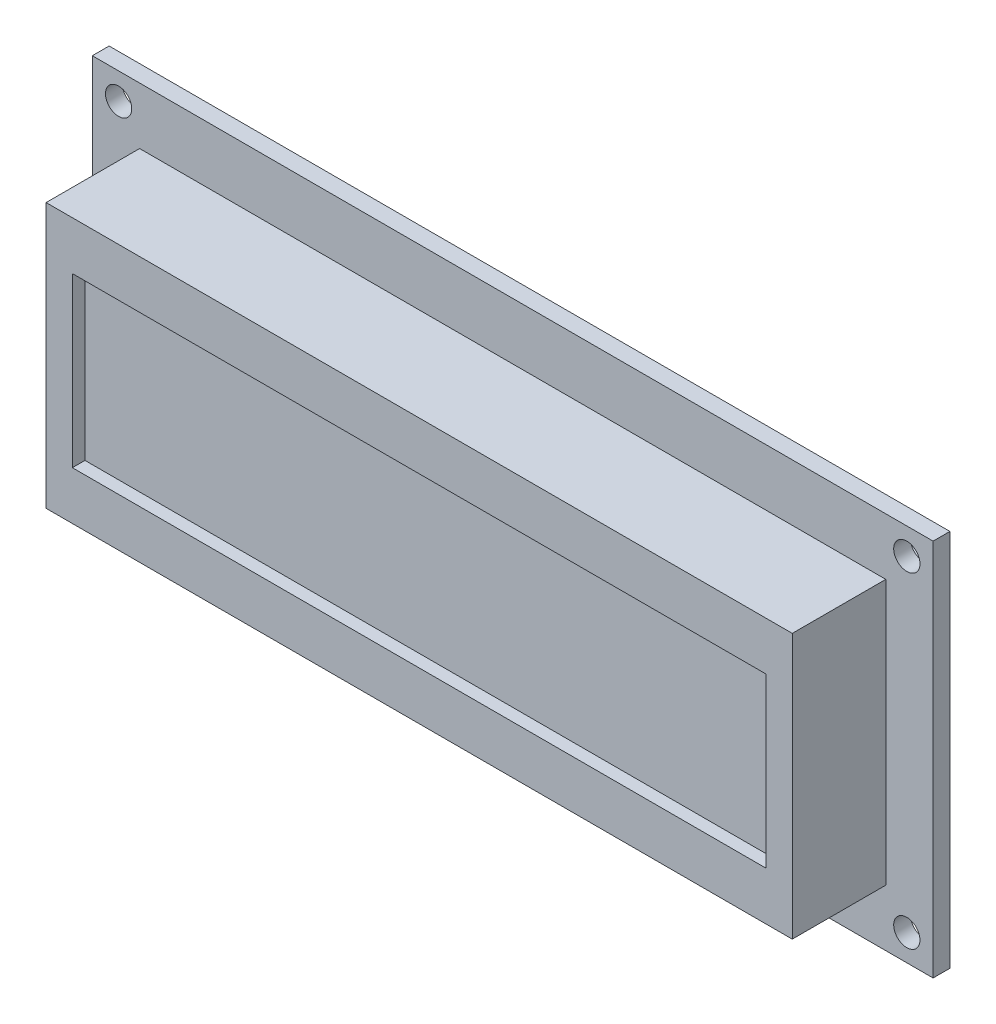
ISO-10303-21;
HEADER;
FILE_DESCRIPTION(('STEP AP214'),'2;1');
FILE_NAME('part.step','',(''),(''),'','','');
FILE_SCHEMA(('AUTOMOTIVE_DESIGN { 1 0 10303 214 1 1 1 1 }'));
ENDSEC;
DATA;
#1=APPLICATION_CONTEXT('core data for automotive mechanical design processes');
#2=APPLICATION_PROTOCOL_DEFINITION('international standard','automotive_design',2000,#1);
#3=PRODUCT_CONTEXT('',#1,'mechanical');
#4=PRODUCT('Part','Part','',(#3));
#5=PRODUCT_RELATED_PRODUCT_CATEGORY('part','',(#4));
#6=PRODUCT_DEFINITION_FORMATION('','',#4);
#7=PRODUCT_DEFINITION_CONTEXT('part definition',#1,'design');
#8=PRODUCT_DEFINITION('design','',#6,#7);
#9=PRODUCT_DEFINITION_SHAPE('','',#8);
#10=(LENGTH_UNIT() NAMED_UNIT(*) SI_UNIT(.MILLI.,.METRE.));
#11=(NAMED_UNIT(*) PLANE_ANGLE_UNIT() SI_UNIT($,.RADIAN.));
#12=(NAMED_UNIT(*) SI_UNIT($,.STERADIAN.) SOLID_ANGLE_UNIT());
#13=UNCERTAINTY_MEASURE_WITH_UNIT(LENGTH_MEASURE(1.E-05),#10,'distance_accuracy_value','');
#14=(GEOMETRIC_REPRESENTATION_CONTEXT(3) GLOBAL_UNCERTAINTY_ASSIGNED_CONTEXT((#13)) GLOBAL_UNIT_ASSIGNED_CONTEXT((#10,
#11,#12)) REPRESENTATION_CONTEXT('',''));
#15=CARTESIAN_POINT('',(0.,0.,0.));
#16=DIRECTION('',(0.,0.,1.));
#17=DIRECTION('',(1.,0.,0.));
#18=AXIS2_PLACEMENT_3D('',#15,#16,#17);
#19=CARTESIAN_POINT('',(0.,0.,8.9));
#20=DIRECTION('',(0.,0.,1.));
#21=DIRECTION('',(1.,0.,0.));
#22=AXIS2_PLACEMENT_3D('',#19,#20,#21);
#23=PLANE('',#22);
#24=DIRECTION('',(0.,-1.,0.));
#25=VECTOR('',#24,1.);
#26=CARTESIAN_POINT('',(35.5,0.,8.9));
#27=LINE('',#26,#25);
#28=CARTESIAN_POINT('',(35.5,12.6,8.9));
#29=VERTEX_POINT('',#28);
#30=CARTESIAN_POINT('',(35.5,-12.6,8.9));
#31=VERTEX_POINT('',#30);
#32=EDGE_CURVE('E174',#29,#31,#27,.T.);
#33=ORIENTED_EDGE('',*,*,#32,.F.);
#34=DIRECTION('',(1.,0.,0.));
#35=VECTOR('',#34,1.);
#36=CARTESIAN_POINT('',(0.,12.6,8.9));
#37=LINE('',#36,#35);
#38=CARTESIAN_POINT('',(-35.5,12.6,8.9));
#39=VERTEX_POINT('',#38);
#40=EDGE_CURVE('E227',#39,#29,#37,.T.);
#41=ORIENTED_EDGE('',*,*,#40,.F.);
#42=DIRECTION('',(0.,-1.,0.));
#43=VECTOR('',#42,1.);
#44=CARTESIAN_POINT('',(-35.5,0.,8.9));
#45=LINE('',#44,#43);
#46=CARTESIAN_POINT('',(-35.5,-12.6,8.9));
#47=VERTEX_POINT('',#46);
#48=EDGE_CURVE('E231',#39,#47,#45,.T.);
#49=ORIENTED_EDGE('',*,*,#48,.T.);
#50=DIRECTION('',(1.,0.,0.));
#51=VECTOR('',#50,1.);
#52=CARTESIAN_POINT('',(0.,-12.6,8.9));
#53=LINE('',#52,#51);
#54=EDGE_CURVE('E212',#47,#31,#53,.T.);
#55=ORIENTED_EDGE('',*,*,#54,.T.);
#56=EDGE_LOOP('',(#33,#41,#49,#55));
#57=FACE_BOUND('',#56,.T.);
#58=DIRECTION('',(-1.,0.,0.));
#59=VECTOR('',#58,1.);
#60=CARTESIAN_POINT('',(0.,-8.,8.9));
#61=LINE('',#60,#59);
#62=CARTESIAN_POINT('',(33.,-8.,8.9));
#63=VERTEX_POINT('',#62);
#64=CARTESIAN_POINT('',(-33.,-8.,8.9));
#65=VERTEX_POINT('',#64);
#66=EDGE_CURVE('E165',#63,#65,#61,.T.);
#67=ORIENTED_EDGE('',*,*,#66,.T.);
#68=DIRECTION('',(0.,1.,0.));
#69=VECTOR('',#68,1.);
#70=CARTESIAN_POINT('',(-33.,0.,8.9));
#71=LINE('',#70,#69);
#72=CARTESIAN_POINT('',(-33.,8.,8.9));
#73=VERTEX_POINT('',#72);
#74=EDGE_CURVE('E57',#65,#73,#71,.T.);
#75=ORIENTED_EDGE('',*,*,#74,.T.);
#76=DIRECTION('',(-1.,0.,0.));
#77=VECTOR('',#76,1.);
#78=CARTESIAN_POINT('',(0.,8.,8.9));
#79=LINE('',#78,#77);
#80=CARTESIAN_POINT('',(33.,8.,8.9));
#81=VERTEX_POINT('',#80);
#82=EDGE_CURVE('E172',#81,#73,#79,.T.);
#83=ORIENTED_EDGE('',*,*,#82,.F.);
#84=DIRECTION('',(0.,1.,0.));
#85=VECTOR('',#84,1.);
#86=CARTESIAN_POINT('',(33.,0.,8.9));
#87=LINE('',#86,#85);
#88=EDGE_CURVE('E194',#63,#81,#87,.T.);
#89=ORIENTED_EDGE('',*,*,#88,.F.);
#90=EDGE_LOOP('',(#67,#75,#83,#89));
#91=FACE_BOUND('',#90,.T.);
#92=ADVANCED_FACE('F41',(#57,#91),#23,.T.);
#93=CARTESIAN_POINT('',(0.,0.,-1.6));
#94=DIRECTION('',(0.,0.,1.));
#95=DIRECTION('',(1.,0.,0.));
#96=AXIS2_PLACEMENT_3D('',#93,#94,#95);
#97=PLANE('',#96);
#98=CARTESIAN_POINT('',(-37.5,15.5,-1.6));
#99=DIRECTION('',(0.,0.,1.));
#100=DIRECTION('',(1.,0.,0.));
#101=AXIS2_PLACEMENT_3D('',#98,#99,#100);
#102=CIRCLE('',#101,1.25);
#103=CARTESIAN_POINT('',(-36.25,15.5,-1.6));
#104=VERTEX_POINT('',#103);
#105=EDGE_CURVE('E191',#104,#104,#102,.T.);
#106=ORIENTED_EDGE('',*,*,#105,.T.);
#107=EDGE_LOOP('',(#106));
#108=FACE_BOUND('',#107,.T.);
#109=CARTESIAN_POINT('',(37.5,-15.5,-1.6));
#110=DIRECTION('',(0.,0.,1.));
#111=DIRECTION('',(1.,0.,0.));
#112=AXIS2_PLACEMENT_3D('',#109,#110,#111);
#113=CIRCLE('',#112,1.25);
#114=CARTESIAN_POINT('',(38.75,-15.5,-1.6));
#115=VERTEX_POINT('',#114);
#116=EDGE_CURVE('E567',#115,#115,#113,.T.);
#117=ORIENTED_EDGE('',*,*,#116,.T.);
#118=EDGE_LOOP('',(#117));
#119=FACE_BOUND('',#118,.T.);
#120=CARTESIAN_POINT('',(-37.5,-15.5,-1.6));
#121=DIRECTION('',(0.,0.,1.));
#122=DIRECTION('',(1.,0.,0.));
#123=AXIS2_PLACEMENT_3D('',#120,#121,#122);
#124=CIRCLE('',#123,1.25);
#125=CARTESIAN_POINT('',(-36.25,-15.5,-1.6));
#126=VERTEX_POINT('',#125);
#127=EDGE_CURVE('E570',#126,#126,#124,.T.);
#128=ORIENTED_EDGE('',*,*,#127,.T.);
#129=EDGE_LOOP('',(#128));
#130=FACE_BOUND('',#129,.T.);
#131=CARTESIAN_POINT('',(37.5,15.5,-1.6));
#132=DIRECTION('',(0.,0.,1.));
#133=DIRECTION('',(1.,0.,0.));
#134=AXIS2_PLACEMENT_3D('',#131,#132,#133);
#135=CIRCLE('',#134,1.25);
#136=CARTESIAN_POINT('',(38.75,15.5,-1.6));
#137=VERTEX_POINT('',#136);
#138=EDGE_CURVE('E576',#137,#137,#135,.T.);
#139=ORIENTED_EDGE('',*,*,#138,.T.);
#140=EDGE_LOOP('',(#139));
#141=FACE_BOUND('',#140,.T.);
#142=DIRECTION('',(0.,-1.,0.));
#143=VECTOR('',#142,1.);
#144=CARTESIAN_POINT('',(40.,0.,-1.6));
#145=LINE('',#144,#143);
#146=CARTESIAN_POINT('',(40.,18.,-1.6));
#147=VERTEX_POINT('',#146);
#148=CARTESIAN_POINT('',(40.,-18.,-1.6));
#149=VERTEX_POINT('',#148);
#150=EDGE_CURVE('E270',#147,#149,#145,.T.);
#151=ORIENTED_EDGE('',*,*,#150,.T.);
#152=DIRECTION('',(1.,0.,0.));
#153=VECTOR('',#152,1.);
#154=CARTESIAN_POINT('',(0.,-18.,-1.6));
#155=LINE('',#154,#153);
#156=CARTESIAN_POINT('',(-40.,-18.,-1.6));
#157=VERTEX_POINT('',#156);
#158=EDGE_CURVE('E281',#157,#149,#155,.T.);
#159=ORIENTED_EDGE('',*,*,#158,.F.);
#160=DIRECTION('',(0.,-1.,0.));
#161=VECTOR('',#160,1.);
#162=CARTESIAN_POINT('',(-40.,0.,-1.6));
#163=LINE('',#162,#161);
#164=CARTESIAN_POINT('',(-40.,18.,-1.6));
#165=VERTEX_POINT('',#164);
#166=EDGE_CURVE('E277',#165,#157,#163,.T.);
#167=ORIENTED_EDGE('',*,*,#166,.F.);
#168=DIRECTION('',(1.,0.,0.));
#169=VECTOR('',#168,1.);
#170=CARTESIAN_POINT('',(0.,18.,-1.6));
#171=LINE('',#170,#169);
#172=EDGE_CURVE('E273',#165,#147,#171,.T.);
#173=ORIENTED_EDGE('',*,*,#172,.T.);
#174=EDGE_LOOP('',(#151,#159,#167,#173));
#175=FACE_BOUND('',#174,.T.);
#176=DIRECTION('',(0.,-1.,0.));
#177=VECTOR('',#176,1.);
#178=CARTESIAN_POINT('',(35.5,0.,-1.6));
#179=LINE('',#178,#177);
#180=CARTESIAN_POINT('',(35.5,12.6,-1.6));
#181=VERTEX_POINT('',#180);
#182=CARTESIAN_POINT('',(35.5,-12.6,-1.6));
#183=VERTEX_POINT('',#182);
#184=EDGE_CURVE('E266',#181,#183,#179,.T.);
#185=ORIENTED_EDGE('',*,*,#184,.F.);
#186=DIRECTION('',(1.,0.,0.));
#187=VECTOR('',#186,1.);
#188=CARTESIAN_POINT('',(0.,12.6,-1.6));
#189=LINE('',#188,#187);
#190=CARTESIAN_POINT('',(-35.5,12.6,-1.6));
#191=VERTEX_POINT('',#190);
#192=EDGE_CURVE('E242',#191,#181,#189,.T.);
#193=ORIENTED_EDGE('',*,*,#192,.F.);
#194=DIRECTION('',(0.,-1.,0.));
#195=VECTOR('',#194,1.);
#196=CARTESIAN_POINT('',(-35.5,0.,-1.6));
#197=LINE('',#196,#195);
#198=CARTESIAN_POINT('',(-35.5,-12.6,-1.6));
#199=VERTEX_POINT('',#198);
#200=EDGE_CURVE('E261',#191,#199,#197,.T.);
#201=ORIENTED_EDGE('',*,*,#200,.T.);
#202=DIRECTION('',(1.,0.,0.));
#203=VECTOR('',#202,1.);
#204=CARTESIAN_POINT('',(0.,-12.6,-1.6));
#205=LINE('',#204,#203);
#206=EDGE_CURVE('E65',#199,#183,#205,.T.);
#207=ORIENTED_EDGE('',*,*,#206,.T.);
#208=EDGE_LOOP('',(#185,#193,#201,#207));
#209=FACE_BOUND('',#208,.T.);
#210=ADVANCED_FACE('F345',(#108,#119,#130,#141,#175,#209),#97,.F.);
#211=CARTESIAN_POINT('',(0.,0.,0.));
#212=DIRECTION('',(0.,0.,1.));
#213=DIRECTION('',(1.,0.,0.));
#214=AXIS2_PLACEMENT_3D('',#211,#212,#213);
#215=PLANE('',#214);
#216=CARTESIAN_POINT('',(-37.5,15.5,0.));
#217=DIRECTION('',(0.,0.,1.));
#218=DIRECTION('',(-1.,0.,0.));
#219=AXIS2_PLACEMENT_3D('',#216,#217,#218);
#220=CIRCLE('',#219,1.25);
#221=CARTESIAN_POINT('',(-38.75,15.5,0.));
#222=VERTEX_POINT('',#221);
#223=EDGE_CURVE('E563',#222,#222,#220,.T.);
#224=ORIENTED_EDGE('',*,*,#223,.F.);
#225=EDGE_LOOP('',(#224));
#226=FACE_BOUND('',#225,.T.);
#227=CARTESIAN_POINT('',(37.5,-15.5,0.));
#228=DIRECTION('',(0.,0.,1.));
#229=DIRECTION('',(-1.,0.,0.));
#230=AXIS2_PLACEMENT_3D('',#227,#228,#229);
#231=CIRCLE('',#230,1.25);
#232=CARTESIAN_POINT('',(36.25,-15.5,0.));
#233=VERTEX_POINT('',#232);
#234=EDGE_CURVE('E584',#233,#233,#231,.T.);
#235=ORIENTED_EDGE('',*,*,#234,.F.);
#236=EDGE_LOOP('',(#235));
#237=FACE_BOUND('',#236,.T.);
#238=CARTESIAN_POINT('',(-37.5,-15.5,0.));
#239=DIRECTION('',(0.,0.,1.));
#240=DIRECTION('',(1.,0.,0.));
#241=AXIS2_PLACEMENT_3D('',#238,#239,#240);
#242=CIRCLE('',#241,1.25);
#243=CARTESIAN_POINT('',(-36.25,-15.5,0.));
#244=VERTEX_POINT('',#243);
#245=EDGE_CURVE('E588',#244,#244,#242,.T.);
#246=ORIENTED_EDGE('',*,*,#245,.F.);
#247=EDGE_LOOP('',(#246));
#248=FACE_BOUND('',#247,.T.);
#249=CARTESIAN_POINT('',(37.5,15.5,0.));
#250=DIRECTION('',(0.,0.,1.));
#251=DIRECTION('',(1.,0.,0.));
#252=AXIS2_PLACEMENT_3D('',#249,#250,#251);
#253=CIRCLE('',#252,1.25);
#254=CARTESIAN_POINT('',(38.75,15.5,0.));
#255=VERTEX_POINT('',#254);
#256=EDGE_CURVE('E580',#255,#255,#253,.T.);
#257=ORIENTED_EDGE('',*,*,#256,.F.);
#258=EDGE_LOOP('',(#257));
#259=FACE_BOUND('',#258,.T.);
#260=DIRECTION('',(0.,-1.,0.));
#261=VECTOR('',#260,1.);
#262=CARTESIAN_POINT('',(40.,0.,0.));
#263=LINE('',#262,#261);
#264=CARTESIAN_POINT('',(40.,18.,0.));
#265=VERTEX_POINT('',#264);
#266=CARTESIAN_POINT('',(40.,-18.,0.));
#267=VERTEX_POINT('',#266);
#268=EDGE_CURVE('E269',#265,#267,#263,.T.);
#269=ORIENTED_EDGE('',*,*,#268,.F.);
#270=DIRECTION('',(1.,0.,0.));
#271=VECTOR('',#270,1.);
#272=CARTESIAN_POINT('',(0.,18.,0.));
#273=LINE('',#272,#271);
#274=CARTESIAN_POINT('',(-40.,18.,0.));
#275=VERTEX_POINT('',#274);
#276=EDGE_CURVE('E289',#275,#265,#273,.T.);
#277=ORIENTED_EDGE('',*,*,#276,.F.);
#278=DIRECTION('',(0.,-1.,0.));
#279=VECTOR('',#278,1.);
#280=CARTESIAN_POINT('',(-40.,0.,0.));
#281=LINE('',#280,#279);
#282=CARTESIAN_POINT('',(-40.,-18.,0.));
#283=VERTEX_POINT('',#282);
#284=EDGE_CURVE('E292',#275,#283,#281,.T.);
#285=ORIENTED_EDGE('',*,*,#284,.T.);
#286=DIRECTION('',(1.,0.,0.));
#287=VECTOR('',#286,1.);
#288=CARTESIAN_POINT('',(0.,-18.,0.));
#289=LINE('',#288,#287);
#290=EDGE_CURVE('E274',#283,#267,#289,.T.);
#291=ORIENTED_EDGE('',*,*,#290,.T.);
#292=EDGE_LOOP('',(#269,#277,#285,#291));
#293=FACE_BOUND('',#292,.T.);
#294=DIRECTION('',(1.,0.,0.));
#295=VECTOR('',#294,1.);
#296=CARTESIAN_POINT('',(0.,12.6,0.));
#297=LINE('',#296,#295);
#298=CARTESIAN_POINT('',(-35.5,12.6,0.));
#299=VERTEX_POINT('',#298);
#300=CARTESIAN_POINT('',(35.5,12.6,0.));
#301=VERTEX_POINT('',#300);
#302=EDGE_CURVE('E302',#299,#301,#297,.T.);
#303=ORIENTED_EDGE('',*,*,#302,.T.);
#304=DIRECTION('',(0.,-1.,0.));
#305=VECTOR('',#304,1.);
#306=CARTESIAN_POINT('',(35.5,0.,0.));
#307=LINE('',#306,#305);
#308=CARTESIAN_POINT('',(35.5,-12.6,0.));
#309=VERTEX_POINT('',#308);
#310=EDGE_CURVE('E11',#301,#309,#307,.T.);
#311=ORIENTED_EDGE('',*,*,#310,.T.);
#312=DIRECTION('',(1.,0.,0.));
#313=VECTOR('',#312,1.);
#314=CARTESIAN_POINT('',(0.,-12.6,0.));
#315=LINE('',#314,#313);
#316=CARTESIAN_POINT('',(-35.5,-12.6,0.));
#317=VERTEX_POINT('',#316);
#318=EDGE_CURVE('E50',#317,#309,#315,.T.);
#319=ORIENTED_EDGE('',*,*,#318,.F.);
#320=DIRECTION('',(0.,-1.,0.));
#321=VECTOR('',#320,1.);
#322=CARTESIAN_POINT('',(-35.5,0.,0.));
#323=LINE('',#322,#321);
#324=EDGE_CURVE('E315',#299,#317,#323,.T.);
#325=ORIENTED_EDGE('',*,*,#324,.F.);
#326=EDGE_LOOP('',(#303,#311,#319,#325));
#327=FACE_BOUND('',#326,.T.);
#328=ADVANCED_FACE('F331',(#226,#237,#248,#259,#293,#327),#215,.T.);
#329=CARTESIAN_POINT('',(40.,0.,-1.6));
#330=DIRECTION('',(-1.,0.,0.));
#331=DIRECTION('',(0.,0.,1.));
#332=AXIS2_PLACEMENT_3D('',#329,#330,#331);
#333=PLANE('',#332);
#334=ORIENTED_EDGE('',*,*,#268,.T.);
#335=DIRECTION('',(0.,0.,1.));
#336=VECTOR('',#335,1.);
#337=CARTESIAN_POINT('',(40.,-18.,-1.6));
#338=LINE('',#337,#336);
#339=EDGE_CURVE('E299',#149,#267,#338,.T.);
#340=ORIENTED_EDGE('',*,*,#339,.F.);
#341=ORIENTED_EDGE('',*,*,#150,.F.);
#342=DIRECTION('',(0.,0.,1.));
#343=VECTOR('',#342,1.);
#344=CARTESIAN_POINT('',(40.,18.,-1.6));
#345=LINE('',#344,#343);
#346=EDGE_CURVE('E285',#147,#265,#345,.T.);
#347=ORIENTED_EDGE('',*,*,#346,.T.);
#348=EDGE_LOOP('',(#334,#340,#341,#347));
#349=FACE_BOUND('',#348,.T.);
#350=ADVANCED_FACE('F43',(#349),#333,.F.);
#351=CARTESIAN_POINT('',(0.,-18.,-1.6));
#352=DIRECTION('',(0.,-1.,0.));
#353=DIRECTION('',(1.,0.,0.));
#354=AXIS2_PLACEMENT_3D('',#351,#352,#353);
#355=PLANE('',#354);
#356=ORIENTED_EDGE('',*,*,#290,.F.);
#357=DIRECTION('',(0.,0.,1.));
#358=VECTOR('',#357,1.);
#359=CARTESIAN_POINT('',(-40.,-18.,-1.6));
#360=LINE('',#359,#358);
#361=EDGE_CURVE('E303',#157,#283,#360,.T.);
#362=ORIENTED_EDGE('',*,*,#361,.F.);
#363=ORIENTED_EDGE('',*,*,#158,.T.);
#364=ORIENTED_EDGE('',*,*,#339,.T.);
#365=EDGE_LOOP('',(#356,#362,#363,#364));
#366=FACE_BOUND('',#365,.T.);
#367=ADVANCED_FACE('F388',(#366),#355,.T.);
#368=CARTESIAN_POINT('',(-40.,0.,-1.6));
#369=DIRECTION('',(-1.,0.,0.));
#370=DIRECTION('',(0.,-1.,0.));
#371=AXIS2_PLACEMENT_3D('',#368,#369,#370);
#372=PLANE('',#371);
#373=ORIENTED_EDGE('',*,*,#284,.F.);
#374=DIRECTION('',(0.,0.,1.));
#375=VECTOR('',#374,1.);
#376=CARTESIAN_POINT('',(-40.,18.,-1.6));
#377=LINE('',#376,#375);
#378=EDGE_CURVE('E306',#165,#275,#377,.T.);
#379=ORIENTED_EDGE('',*,*,#378,.F.);
#380=ORIENTED_EDGE('',*,*,#166,.T.);
#381=ORIENTED_EDGE('',*,*,#361,.T.);
#382=EDGE_LOOP('',(#373,#379,#380,#381));
#383=FACE_BOUND('',#382,.T.);
#384=ADVANCED_FACE('F391',(#383),#372,.T.);
#385=CARTESIAN_POINT('',(0.,18.,-1.6));
#386=DIRECTION('',(0.,-1.,0.));
#387=DIRECTION('',(1.,0.,0.));
#388=AXIS2_PLACEMENT_3D('',#385,#386,#387);
#389=PLANE('',#388);
#390=ORIENTED_EDGE('',*,*,#276,.T.);
#391=ORIENTED_EDGE('',*,*,#346,.F.);
#392=ORIENTED_EDGE('',*,*,#172,.F.);
#393=ORIENTED_EDGE('',*,*,#378,.T.);
#394=EDGE_LOOP('',(#390,#391,#392,#393));
#395=FACE_BOUND('',#394,.T.);
#396=ADVANCED_FACE('F378',(#395),#389,.F.);
#397=CARTESIAN_POINT('',(0.,12.6,-4.6));
#398=DIRECTION('',(0.,-1.,0.));
#399=DIRECTION('',(1.,0.,0.));
#400=AXIS2_PLACEMENT_3D('',#397,#398,#399);
#401=PLANE('',#400);
#402=ORIENTED_EDGE('',*,*,#302,.F.);
#403=DIRECTION('',(0.,0.,1.));
#404=VECTOR('',#403,1.);
#405=CARTESIAN_POINT('',(-35.5,12.6,-4.6));
#406=LINE('',#405,#404);
#407=EDGE_CURVE('E253',#299,#39,#406,.T.);
#408=ORIENTED_EDGE('',*,*,#407,.T.);
#409=ORIENTED_EDGE('',*,*,#40,.T.);
#410=DIRECTION('',(0.,0.,1.));
#411=VECTOR('',#410,1.);
#412=CARTESIAN_POINT('',(35.5,12.6,-4.6));
#413=LINE('',#412,#411);
#414=EDGE_CURVE('E223',#301,#29,#413,.T.);
#415=ORIENTED_EDGE('',*,*,#414,.F.);
#416=EDGE_LOOP('',(#402,#408,#409,#415));
#417=FACE_BOUND('',#416,.T.);
#418=ADVANCED_FACE('F334',(#417),#401,.F.);
#419=CARTESIAN_POINT('',(-35.5,0.,-4.6));
#420=DIRECTION('',(-1.,0.,0.));
#421=DIRECTION('',(0.,-1.,0.));
#422=AXIS2_PLACEMENT_3D('',#419,#420,#421);
#423=PLANE('',#422);
#424=ORIENTED_EDGE('',*,*,#407,.F.);
#425=ORIENTED_EDGE('',*,*,#324,.T.);
#426=DIRECTION('',(0.,0.,1.));
#427=VECTOR('',#426,1.);
#428=CARTESIAN_POINT('',(-35.5,-12.6,-4.6));
#429=LINE('',#428,#427);
#430=EDGE_CURVE('E248',#317,#47,#429,.T.);
#431=ORIENTED_EDGE('',*,*,#430,.T.);
#432=ORIENTED_EDGE('',*,*,#48,.F.);
#433=EDGE_LOOP('',(#424,#425,#431,#432));
#434=FACE_BOUND('',#433,.T.);
#435=ADVANCED_FACE('F338',(#434),#423,.T.);
#436=CARTESIAN_POINT('',(0.,-12.6,-4.6));
#437=DIRECTION('',(0.,-1.,0.));
#438=DIRECTION('',(1.,0.,0.));
#439=AXIS2_PLACEMENT_3D('',#436,#437,#438);
#440=PLANE('',#439);
#441=ORIENTED_EDGE('',*,*,#430,.F.);
#442=ORIENTED_EDGE('',*,*,#318,.T.);
#443=DIRECTION('',(0.,0.,1.));
#444=VECTOR('',#443,1.);
#445=CARTESIAN_POINT('',(35.5,-12.6,-4.6));
#446=LINE('',#445,#444);
#447=EDGE_CURVE('E243',#309,#31,#446,.T.);
#448=ORIENTED_EDGE('',*,*,#447,.T.);
#449=ORIENTED_EDGE('',*,*,#54,.F.);
#450=EDGE_LOOP('',(#441,#442,#448,#449));
#451=FACE_BOUND('',#450,.T.);
#452=ADVANCED_FACE('F322',(#451),#440,.T.);
#453=CARTESIAN_POINT('',(35.5,0.,-4.6));
#454=DIRECTION('',(-1.,0.,0.));
#455=DIRECTION('',(0.,0.,1.));
#456=AXIS2_PLACEMENT_3D('',#453,#454,#455);
#457=PLANE('',#456);
#458=ORIENTED_EDGE('',*,*,#310,.F.);
#459=ORIENTED_EDGE('',*,*,#414,.T.);
#460=ORIENTED_EDGE('',*,*,#32,.T.);
#461=ORIENTED_EDGE('',*,*,#447,.F.);
#462=EDGE_LOOP('',(#458,#459,#460,#461));
#463=FACE_BOUND('',#462,.T.);
#464=ADVANCED_FACE('F328',(#463),#457,.F.);
#465=CARTESIAN_POINT('',(35.5,12.6,-4.6));
#466=VERTEX_POINT('',#465);
#467=EDGE_CURVE('E254',#466,#181,#413,.T.);
#468=ORIENTED_EDGE('',*,*,#467,.T.);
#469=ORIENTED_EDGE('',*,*,#184,.T.);
#470=CARTESIAN_POINT('',(35.5,-12.6,-4.6));
#471=VERTEX_POINT('',#470);
#472=EDGE_CURVE('E238',#471,#183,#446,.T.);
#473=ORIENTED_EDGE('',*,*,#472,.F.);
#474=DIRECTION('',(0.,-1.,0.));
#475=VECTOR('',#474,1.);
#476=CARTESIAN_POINT('',(35.5,0.,-4.6));
#477=LINE('',#476,#475);
#478=EDGE_CURVE('E208',#466,#471,#477,.T.);
#479=ORIENTED_EDGE('',*,*,#478,.F.);
#480=EDGE_LOOP('',(#468,#469,#473,#479));
#481=FACE_BOUND('',#480,.T.);
#482=ADVANCED_FACE('F381',(#481),#457,.F.);
#483=ORIENTED_EDGE('',*,*,#206,.F.);
#484=CARTESIAN_POINT('',(-35.5,-12.6,-4.6));
#485=VERTEX_POINT('',#484);
#486=EDGE_CURVE('E244',#485,#199,#429,.T.);
#487=ORIENTED_EDGE('',*,*,#486,.F.);
#488=DIRECTION('',(1.,0.,0.));
#489=VECTOR('',#488,1.);
#490=CARTESIAN_POINT('',(0.,-12.6,-4.6));
#491=LINE('',#490,#489);
#492=EDGE_CURVE('E219',#485,#471,#491,.T.);
#493=ORIENTED_EDGE('',*,*,#492,.T.);
#494=ORIENTED_EDGE('',*,*,#472,.T.);
#495=EDGE_LOOP('',(#483,#487,#493,#494));
#496=FACE_BOUND('',#495,.T.);
#497=ADVANCED_FACE('F372',(#496),#440,.T.);
#498=ORIENTED_EDGE('',*,*,#200,.F.);
#499=CARTESIAN_POINT('',(-35.5,12.6,-4.6));
#500=VERTEX_POINT('',#499);
#501=EDGE_CURVE('E249',#500,#191,#406,.T.);
#502=ORIENTED_EDGE('',*,*,#501,.F.);
#503=DIRECTION('',(0.,-1.,0.));
#504=VECTOR('',#503,1.);
#505=CARTESIAN_POINT('',(-35.5,0.,-4.6));
#506=LINE('',#505,#504);
#507=EDGE_CURVE('E215',#500,#485,#506,.T.);
#508=ORIENTED_EDGE('',*,*,#507,.T.);
#509=ORIENTED_EDGE('',*,*,#486,.T.);
#510=EDGE_LOOP('',(#498,#502,#508,#509));
#511=FACE_BOUND('',#510,.T.);
#512=ADVANCED_FACE('F375',(#511),#423,.T.);
#513=ORIENTED_EDGE('',*,*,#501,.T.);
#514=ORIENTED_EDGE('',*,*,#192,.T.);
#515=ORIENTED_EDGE('',*,*,#467,.F.);
#516=DIRECTION('',(1.,0.,0.));
#517=VECTOR('',#516,1.);
#518=CARTESIAN_POINT('',(0.,12.6,-4.6));
#519=LINE('',#518,#517);
#520=EDGE_CURVE('E211',#500,#466,#519,.T.);
#521=ORIENTED_EDGE('',*,*,#520,.F.);
#522=EDGE_LOOP('',(#513,#514,#515,#521));
#523=FACE_BOUND('',#522,.T.);
#524=ADVANCED_FACE('F367',(#523),#401,.F.);
#525=CARTESIAN_POINT('',(0.,0.,-4.6));
#526=DIRECTION('',(0.,0.,1.));
#527=DIRECTION('',(1.,0.,0.));
#528=AXIS2_PLACEMENT_3D('',#525,#526,#527);
#529=PLANE('',#528);
#530=ORIENTED_EDGE('',*,*,#478,.T.);
#531=ORIENTED_EDGE('',*,*,#492,.F.);
#532=ORIENTED_EDGE('',*,*,#507,.F.);
#533=ORIENTED_EDGE('',*,*,#520,.T.);
#534=EDGE_LOOP('',(#530,#531,#532,#533));
#535=FACE_BOUND('',#534,.T.);
#536=ADVANCED_FACE('F365',(#535),#529,.F.);
#537=CARTESIAN_POINT('',(-33.,0.,7.7));
#538=DIRECTION('',(1.,0.,0.));
#539=DIRECTION('',(0.,0.,-1.));
#540=AXIS2_PLACEMENT_3D('',#537,#538,#539);
#541=PLANE('',#540);
#542=ORIENTED_EDGE('',*,*,#74,.F.);
#543=DIRECTION('',(0.,0.,1.));
#544=VECTOR('',#543,1.);
#545=CARTESIAN_POINT('',(-33.,-8.,7.7));
#546=LINE('',#545,#544);
#547=CARTESIAN_POINT('',(-33.,-8.,7.7));
#548=VERTEX_POINT('',#547);
#549=EDGE_CURVE('E159',#548,#65,#546,.T.);
#550=ORIENTED_EDGE('',*,*,#549,.F.);
#551=DIRECTION('',(0.,1.,0.));
#552=VECTOR('',#551,1.);
#553=CARTESIAN_POINT('',(-33.,0.,7.7));
#554=LINE('',#553,#552);
#555=CARTESIAN_POINT('',(-33.,8.,7.7));
#556=VERTEX_POINT('',#555);
#557=EDGE_CURVE('E154',#548,#556,#554,.T.);
#558=ORIENTED_EDGE('',*,*,#557,.T.);
#559=DIRECTION('',(0.,0.,1.));
#560=VECTOR('',#559,1.);
#561=CARTESIAN_POINT('',(-33.,8.,7.7));
#562=LINE('',#561,#560);
#563=EDGE_CURVE('E157',#556,#73,#562,.T.);
#564=ORIENTED_EDGE('',*,*,#563,.T.);
#565=EDGE_LOOP('',(#542,#550,#558,#564));
#566=FACE_BOUND('',#565,.T.);
#567=ADVANCED_FACE('F156',(#566),#541,.T.);
#568=CARTESIAN_POINT('',(0.,8.,7.7));
#569=DIRECTION('',(0.,1.,0.));
#570=DIRECTION('',(0.,0.,1.));
#571=AXIS2_PLACEMENT_3D('',#568,#569,#570);
#572=PLANE('',#571);
#573=ORIENTED_EDGE('',*,*,#82,.T.);
#574=ORIENTED_EDGE('',*,*,#563,.F.);
#575=DIRECTION('',(-1.,0.,0.));
#576=VECTOR('',#575,1.);
#577=CARTESIAN_POINT('',(0.,8.,7.7));
#578=LINE('',#577,#576);
#579=CARTESIAN_POINT('',(33.,8.,7.7));
#580=VERTEX_POINT('',#579);
#581=EDGE_CURVE('E164',#580,#556,#578,.T.);
#582=ORIENTED_EDGE('',*,*,#581,.F.);
#583=DIRECTION('',(0.,0.,1.));
#584=VECTOR('',#583,1.);
#585=CARTESIAN_POINT('',(33.,8.,7.7));
#586=LINE('',#585,#584);
#587=EDGE_CURVE('E175',#580,#81,#586,.T.);
#588=ORIENTED_EDGE('',*,*,#587,.T.);
#589=EDGE_LOOP('',(#573,#574,#582,#588));
#590=FACE_BOUND('',#589,.T.);
#591=ADVANCED_FACE('F169',(#590),#572,.F.);
#592=CARTESIAN_POINT('',(33.,0.,7.7));
#593=DIRECTION('',(1.,0.,0.));
#594=DIRECTION('',(0.,0.,-1.));
#595=AXIS2_PLACEMENT_3D('',#592,#593,#594);
#596=PLANE('',#595);
#597=ORIENTED_EDGE('',*,*,#88,.T.);
#598=ORIENTED_EDGE('',*,*,#587,.F.);
#599=DIRECTION('',(0.,1.,0.));
#600=VECTOR('',#599,1.);
#601=CARTESIAN_POINT('',(33.,0.,7.7));
#602=LINE('',#601,#600);
#603=CARTESIAN_POINT('',(33.,-8.,7.7));
#604=VERTEX_POINT('',#603);
#605=EDGE_CURVE('E179',#604,#580,#602,.T.);
#606=ORIENTED_EDGE('',*,*,#605,.F.);
#607=DIRECTION('',(0.,0.,1.));
#608=VECTOR('',#607,1.);
#609=CARTESIAN_POINT('',(33.,-8.,7.7));
#610=LINE('',#609,#608);
#611=EDGE_CURVE('E203',#604,#63,#610,.T.);
#612=ORIENTED_EDGE('',*,*,#611,.T.);
#613=EDGE_LOOP('',(#597,#598,#606,#612));
#614=FACE_BOUND('',#613,.T.);
#615=ADVANCED_FACE('F352',(#614),#596,.F.);
#616=CARTESIAN_POINT('',(0.,-8.,7.7));
#617=DIRECTION('',(0.,1.,0.));
#618=DIRECTION('',(0.,0.,1.));
#619=AXIS2_PLACEMENT_3D('',#616,#617,#618);
#620=PLANE('',#619);
#621=ORIENTED_EDGE('',*,*,#66,.F.);
#622=ORIENTED_EDGE('',*,*,#611,.F.);
#623=DIRECTION('',(-1.,0.,0.));
#624=VECTOR('',#623,1.);
#625=CARTESIAN_POINT('',(0.,-8.,7.7));
#626=LINE('',#625,#624);
#627=EDGE_CURVE('E183',#604,#548,#626,.T.);
#628=ORIENTED_EDGE('',*,*,#627,.T.);
#629=ORIENTED_EDGE('',*,*,#549,.T.);
#630=EDGE_LOOP('',(#621,#622,#628,#629));
#631=FACE_BOUND('',#630,.T.);
#632=ADVANCED_FACE('F350',(#631),#620,.T.);
#633=CARTESIAN_POINT('',(0.,0.,7.7));
#634=DIRECTION('',(0.,0.,1.));
#635=DIRECTION('',(1.,0.,0.));
#636=AXIS2_PLACEMENT_3D('',#633,#634,#635);
#637=PLANE('',#636);
#638=ORIENTED_EDGE('',*,*,#557,.F.);
#639=ORIENTED_EDGE('',*,*,#627,.F.);
#640=ORIENTED_EDGE('',*,*,#605,.T.);
#641=ORIENTED_EDGE('',*,*,#581,.T.);
#642=EDGE_LOOP('',(#638,#639,#640,#641));
#643=FACE_BOUND('',#642,.T.);
#644=ADVANCED_FACE('F177',(#643),#637,.T.);
#645=CARTESIAN_POINT('',(37.5,15.5,-4.6));
#646=DIRECTION('',(0.,0.,1.));
#647=DIRECTION('',(1.,0.,0.));
#648=AXIS2_PLACEMENT_3D('',#645,#646,#647);
#649=CYLINDRICAL_SURFACE('',#648,1.25);
#650=ORIENTED_EDGE('',*,*,#256,.T.);
#651=EDGE_LOOP('',(#650));
#652=FACE_BOUND('',#651,.T.);
#653=ORIENTED_EDGE('',*,*,#138,.F.);
#654=EDGE_LOOP('',(#653));
#655=FACE_BOUND('',#654,.T.);
#656=ADVANCED_FACE('F518',(#652,#655),#649,.F.);
#657=CARTESIAN_POINT('',(-37.5,-15.5,-4.6));
#658=DIRECTION('',(0.,0.,1.));
#659=DIRECTION('',(1.,0.,0.));
#660=AXIS2_PLACEMENT_3D('',#657,#658,#659);
#661=CYLINDRICAL_SURFACE('',#660,1.25);
#662=ORIENTED_EDGE('',*,*,#245,.T.);
#663=EDGE_LOOP('',(#662));
#664=FACE_BOUND('',#663,.T.);
#665=ORIENTED_EDGE('',*,*,#127,.F.);
#666=EDGE_LOOP('',(#665));
#667=FACE_BOUND('',#666,.T.);
#668=ADVANCED_FACE('F526',(#664,#667),#661,.F.);
#669=CARTESIAN_POINT('',(37.5,-15.5,-4.6));
#670=DIRECTION('',(0.,0.,1.));
#671=DIRECTION('',(1.,0.,0.));
#672=AXIS2_PLACEMENT_3D('',#669,#670,#671);
#673=CYLINDRICAL_SURFACE('',#672,1.25);
#674=ORIENTED_EDGE('',*,*,#234,.T.);
#675=EDGE_LOOP('',(#674));
#676=FACE_BOUND('',#675,.T.);
#677=ORIENTED_EDGE('',*,*,#116,.F.);
#678=EDGE_LOOP('',(#677));
#679=FACE_BOUND('',#678,.T.);
#680=ADVANCED_FACE('F533',(#676,#679),#673,.F.);
#681=CARTESIAN_POINT('',(-37.5,15.5,-4.6));
#682=DIRECTION('',(0.,0.,1.));
#683=DIRECTION('',(1.,0.,0.));
#684=AXIS2_PLACEMENT_3D('',#681,#682,#683);
#685=CYLINDRICAL_SURFACE('',#684,1.25);
#686=ORIENTED_EDGE('',*,*,#223,.T.);
#687=EDGE_LOOP('',(#686));
#688=FACE_BOUND('',#687,.T.);
#689=ORIENTED_EDGE('',*,*,#105,.F.);
#690=EDGE_LOOP('',(#689));
#691=FACE_BOUND('',#690,.T.);
#692=ADVANCED_FACE('F541',(#688,#691),#685,.F.);
#693=CLOSED_SHELL('',(#92,#210,#328,#350,#367,#384,#396,#418,#435,#452,#464,#482,#497,#512,#524,
#536,#567,#591,#615,#632,#644,#656,#668,#680,#692));
#694=MANIFOLD_SOLID_BREP('B2',#693);
#695=ADVANCED_BREP_SHAPE_REPRESENTATION('',(#18,#694),#14);
#696=SHAPE_DEFINITION_REPRESENTATION(#9,#695);
ENDSEC;
END-ISO-10303-21;
